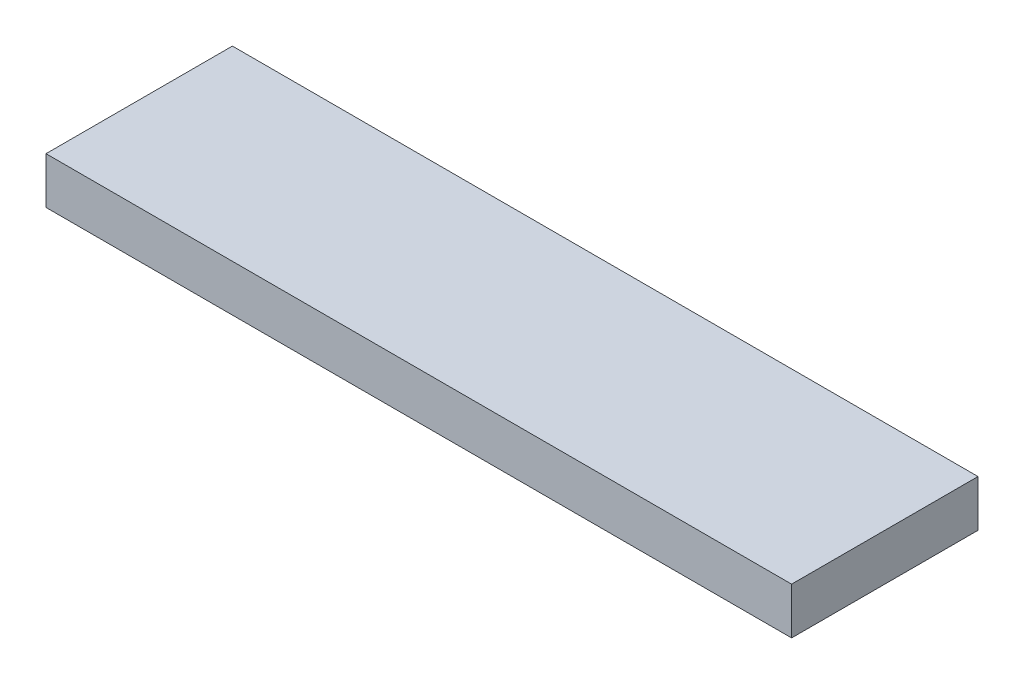
ISO-10303-21;
HEADER;
FILE_DESCRIPTION(('STEP AP214'),'2;1');
FILE_NAME('part.step','',(''),(''),'','','');
FILE_SCHEMA(('AUTOMOTIVE_DESIGN { 1 0 10303 214 1 1 1 1 }'));
ENDSEC;
DATA;
#1=APPLICATION_CONTEXT('core data for automotive mechanical design processes');
#2=APPLICATION_PROTOCOL_DEFINITION('international standard','automotive_design',2000,#1);
#3=PRODUCT_CONTEXT('',#1,'mechanical');
#4=PRODUCT('Part','Part','',(#3));
#5=PRODUCT_RELATED_PRODUCT_CATEGORY('part','',(#4));
#6=PRODUCT_DEFINITION_FORMATION('','',#4);
#7=PRODUCT_DEFINITION_CONTEXT('part definition',#1,'design');
#8=PRODUCT_DEFINITION('design','',#6,#7);
#9=PRODUCT_DEFINITION_SHAPE('','',#8);
#10=(LENGTH_UNIT() NAMED_UNIT(*) SI_UNIT(.MILLI.,.METRE.));
#11=(NAMED_UNIT(*) PLANE_ANGLE_UNIT() SI_UNIT($,.RADIAN.));
#12=(NAMED_UNIT(*) SI_UNIT($,.STERADIAN.) SOLID_ANGLE_UNIT());
#13=UNCERTAINTY_MEASURE_WITH_UNIT(LENGTH_MEASURE(1.E-05),#10,'distance_accuracy_value','');
#14=(GEOMETRIC_REPRESENTATION_CONTEXT(3) GLOBAL_UNCERTAINTY_ASSIGNED_CONTEXT((#13)) GLOBAL_UNIT_ASSIGNED_CONTEXT((#10,
#11,#12)) REPRESENTATION_CONTEXT('',''));
#15=CARTESIAN_POINT('',(0.,0.,0.));
#16=DIRECTION('',(0.,0.,1.));
#17=DIRECTION('',(1.,0.,0.));
#18=AXIS2_PLACEMENT_3D('',#15,#16,#17);
#19=CARTESIAN_POINT('',(101.6,12.7,25.4));
#20=DIRECTION('',(-1.,0.,0.));
#21=DIRECTION('',(0.,0.,1.));
#22=AXIS2_PLACEMENT_3D('',#19,#20,#21);
#23=PLANE('',#22);
#24=DIRECTION('',(0.,0.,-1.));
#25=VECTOR('',#24,1.);
#26=CARTESIAN_POINT('',(101.6,0.,25.4));
#27=LINE('',#26,#25);
#28=CARTESIAN_POINT('',(101.6,0.,25.4));
#29=VERTEX_POINT('',#28);
#30=CARTESIAN_POINT('',(101.6,0.,-25.4));
#31=VERTEX_POINT('',#30);
#32=EDGE_CURVE('E96',#29,#31,#27,.T.);
#33=ORIENTED_EDGE('',*,*,#32,.T.);
#34=DIRECTION('',(0.,-1.,0.));
#35=VECTOR('',#34,1.);
#36=CARTESIAN_POINT('',(101.6,12.7,-25.4));
#37=LINE('',#36,#35);
#38=CARTESIAN_POINT('',(101.6,12.7,-25.4));
#39=VERTEX_POINT('',#38);
#40=EDGE_CURVE('E11',#39,#31,#37,.T.);
#41=ORIENTED_EDGE('',*,*,#40,.F.);
#42=DIRECTION('',(0.,0.,-1.));
#43=VECTOR('',#42,1.);
#44=CARTESIAN_POINT('',(101.6,12.7,25.4));
#45=LINE('',#44,#43);
#46=CARTESIAN_POINT('',(101.6,12.7,25.4));
#47=VERTEX_POINT('',#46);
#48=EDGE_CURVE('E84',#47,#39,#45,.T.);
#49=ORIENTED_EDGE('',*,*,#48,.F.);
#50=DIRECTION('',(0.,-1.,0.));
#51=VECTOR('',#50,1.);
#52=CARTESIAN_POINT('',(101.6,12.7,25.4));
#53=LINE('',#52,#51);
#54=EDGE_CURVE('E92',#47,#29,#53,.T.);
#55=ORIENTED_EDGE('',*,*,#54,.T.);
#56=EDGE_LOOP('',(#33,#41,#49,#55));
#57=FACE_BOUND('',#56,.T.);
#58=ADVANCED_FACE('F33',(#57),#23,.F.);
#59=CARTESIAN_POINT('',(-101.6,12.7,-25.4));
#60=DIRECTION('',(0.,0.,1.));
#61=DIRECTION('',(1.,0.,0.));
#62=AXIS2_PLACEMENT_3D('',#59,#60,#61);
#63=PLANE('',#62);
#64=DIRECTION('',(-1.,0.,0.));
#65=VECTOR('',#64,1.);
#66=CARTESIAN_POINT('',(-101.6,0.,-25.4));
#67=LINE('',#66,#65);
#68=CARTESIAN_POINT('',(-101.6,0.,-25.4));
#69=VERTEX_POINT('',#68);
#70=EDGE_CURVE('E88',#31,#69,#67,.T.);
#71=ORIENTED_EDGE('',*,*,#70,.T.);
#72=DIRECTION('',(0.,-1.,0.));
#73=VECTOR('',#72,1.);
#74=CARTESIAN_POINT('',(-101.6,12.7,-25.4));
#75=LINE('',#74,#73);
#76=CARTESIAN_POINT('',(-101.6,12.7,-25.4));
#77=VERTEX_POINT('',#76);
#78=EDGE_CURVE('E41',#77,#69,#75,.T.);
#79=ORIENTED_EDGE('',*,*,#78,.F.);
#80=DIRECTION('',(-1.,0.,0.));
#81=VECTOR('',#80,1.);
#82=CARTESIAN_POINT('',(-101.6,12.7,-25.4));
#83=LINE('',#82,#81);
#84=EDGE_CURVE('E79',#39,#77,#83,.T.);
#85=ORIENTED_EDGE('',*,*,#84,.F.);
#86=ORIENTED_EDGE('',*,*,#40,.T.);
#87=EDGE_LOOP('',(#71,#79,#85,#86));
#88=FACE_BOUND('',#87,.T.);
#89=ADVANCED_FACE('F87',(#88),#63,.F.);
#90=CARTESIAN_POINT('',(-101.6,12.7,25.4));
#91=DIRECTION('',(1.,0.,0.));
#92=DIRECTION('',(0.,0.,-1.));
#93=AXIS2_PLACEMENT_3D('',#90,#91,#92);
#94=PLANE('',#93);
#95=DIRECTION('',(0.,0.,1.));
#96=VECTOR('',#95,1.);
#97=CARTESIAN_POINT('',(-101.6,0.,25.4));
#98=LINE('',#97,#96);
#99=CARTESIAN_POINT('',(-101.6,0.,25.4));
#100=VERTEX_POINT('',#99);
#101=EDGE_CURVE('E66',#69,#100,#98,.T.);
#102=ORIENTED_EDGE('',*,*,#101,.T.);
#103=DIRECTION('',(0.,-1.,0.));
#104=VECTOR('',#103,1.);
#105=CARTESIAN_POINT('',(-101.6,12.7,25.4));
#106=LINE('',#105,#104);
#107=CARTESIAN_POINT('',(-101.6,12.7,25.4));
#108=VERTEX_POINT('',#107);
#109=EDGE_CURVE('E89',#108,#100,#106,.T.);
#110=ORIENTED_EDGE('',*,*,#109,.F.);
#111=DIRECTION('',(0.,0.,1.));
#112=VECTOR('',#111,1.);
#113=CARTESIAN_POINT('',(-101.6,12.7,25.4));
#114=LINE('',#113,#112);
#115=EDGE_CURVE('E82',#77,#108,#114,.T.);
#116=ORIENTED_EDGE('',*,*,#115,.F.);
#117=ORIENTED_EDGE('',*,*,#78,.T.);
#118=EDGE_LOOP('',(#102,#110,#116,#117));
#119=FACE_BOUND('',#118,.T.);
#120=ADVANCED_FACE('F90',(#119),#94,.F.);
#121=CARTESIAN_POINT('',(-101.6,12.7,25.4));
#122=DIRECTION('',(0.,0.,-1.));
#123=DIRECTION('',(-1.,0.,0.));
#124=AXIS2_PLACEMENT_3D('',#121,#122,#123);
#125=PLANE('',#124);
#126=DIRECTION('',(1.,0.,0.));
#127=VECTOR('',#126,1.);
#128=CARTESIAN_POINT('',(-101.6,0.,25.4));
#129=LINE('',#128,#127);
#130=EDGE_CURVE('E72',#100,#29,#129,.T.);
#131=ORIENTED_EDGE('',*,*,#130,.T.);
#132=ORIENTED_EDGE('',*,*,#54,.F.);
#133=DIRECTION('',(1.,0.,0.));
#134=VECTOR('',#133,1.);
#135=CARTESIAN_POINT('',(-101.6,12.7,25.4));
#136=LINE('',#135,#134);
#137=EDGE_CURVE('E49',#108,#47,#136,.T.);
#138=ORIENTED_EDGE('',*,*,#137,.F.);
#139=ORIENTED_EDGE('',*,*,#109,.T.);
#140=EDGE_LOOP('',(#131,#132,#138,#139));
#141=FACE_BOUND('',#140,.T.);
#142=ADVANCED_FACE('F103',(#141),#125,.F.);
#143=CARTESIAN_POINT('',(0.,12.7,0.));
#144=DIRECTION('',(0.,-1.,0.));
#145=DIRECTION('',(0.,0.,-1.));
#146=AXIS2_PLACEMENT_3D('',#143,#144,#145);
#147=PLANE('',#146);
#148=ORIENTED_EDGE('',*,*,#48,.T.);
#149=ORIENTED_EDGE('',*,*,#84,.T.);
#150=ORIENTED_EDGE('',*,*,#115,.T.);
#151=ORIENTED_EDGE('',*,*,#137,.T.);
#152=EDGE_LOOP('',(#148,#149,#150,#151));
#153=FACE_BOUND('',#152,.T.);
#154=ADVANCED_FACE('F80',(#153),#147,.F.);
#155=CARTESIAN_POINT('',(0.,0.,0.));
#156=DIRECTION('',(0.,-1.,0.));
#157=DIRECTION('',(0.,0.,-1.));
#158=AXIS2_PLACEMENT_3D('',#155,#156,#157);
#159=PLANE('',#158);
#160=ORIENTED_EDGE('',*,*,#32,.F.);
#161=ORIENTED_EDGE('',*,*,#130,.F.);
#162=ORIENTED_EDGE('',*,*,#101,.F.);
#163=ORIENTED_EDGE('',*,*,#70,.F.);
#164=EDGE_LOOP('',(#160,#161,#162,#163));
#165=FACE_BOUND('',#164,.T.);
#166=ADVANCED_FACE('F106',(#165),#159,.T.);
#167=CLOSED_SHELL('',(#58,#89,#120,#142,#154,#166));
#168=MANIFOLD_SOLID_BREP('B2',#167);
#169=ADVANCED_BREP_SHAPE_REPRESENTATION('',(#18,#168),#14);
#170=SHAPE_DEFINITION_REPRESENTATION(#9,#169);
ENDSEC;
END-ISO-10303-21;
